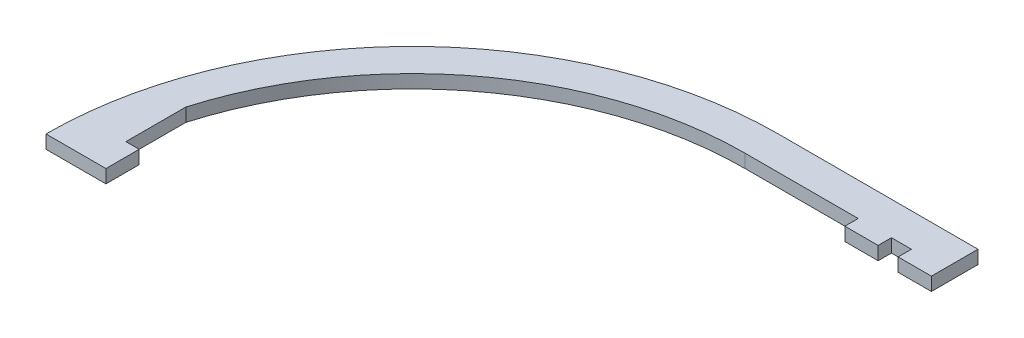
ISO-10303-21;
HEADER;
FILE_DESCRIPTION(('STEP AP214'),'2;1');
FILE_NAME('part.step','',(''),(''),'','','');
FILE_SCHEMA(('AUTOMOTIVE_DESIGN { 1 0 10303 214 1 1 1 1 }'));
ENDSEC;
DATA;
#1=APPLICATION_CONTEXT('core data for automotive mechanical design processes');
#2=APPLICATION_PROTOCOL_DEFINITION('international standard','automotive_design',2000,#1);
#3=PRODUCT_CONTEXT('',#1,'mechanical');
#4=PRODUCT('Part','Part','',(#3));
#5=PRODUCT_RELATED_PRODUCT_CATEGORY('part','',(#4));
#6=PRODUCT_DEFINITION_FORMATION('','',#4);
#7=PRODUCT_DEFINITION_CONTEXT('part definition',#1,'design');
#8=PRODUCT_DEFINITION('design','',#6,#7);
#9=PRODUCT_DEFINITION_SHAPE('','',#8);
#10=(LENGTH_UNIT() NAMED_UNIT(*) SI_UNIT(.MILLI.,.METRE.));
#11=(NAMED_UNIT(*) PLANE_ANGLE_UNIT() SI_UNIT($,.RADIAN.));
#12=(NAMED_UNIT(*) SI_UNIT($,.STERADIAN.) SOLID_ANGLE_UNIT());
#13=UNCERTAINTY_MEASURE_WITH_UNIT(LENGTH_MEASURE(1.E-05),#10,'distance_accuracy_value','');
#14=(GEOMETRIC_REPRESENTATION_CONTEXT(3) GLOBAL_UNCERTAINTY_ASSIGNED_CONTEXT((#13)) GLOBAL_UNIT_ASSIGNED_CONTEXT((#10,
#11,#12)) REPRESENTATION_CONTEXT('',''));
#15=CARTESIAN_POINT('',(0.,0.,0.));
#16=DIRECTION('',(0.,0.,1.));
#17=DIRECTION('',(1.,0.,0.));
#18=AXIS2_PLACEMENT_3D('',#15,#16,#17);
#19=CARTESIAN_POINT('',(0.,2.,-50.));
#20=DIRECTION('',(0.,0.,-1.));
#21=DIRECTION('',(-1.,0.,0.));
#22=AXIS2_PLACEMENT_3D('',#19,#20,#21);
#23=PLANE('',#22);
#24=DIRECTION('',(1.,0.,0.));
#25=VECTOR('',#24,1.);
#26=CARTESIAN_POINT('',(0.,2.,-50.));
#27=LINE('',#26,#25);
#28=CARTESIAN_POINT('',(22.,2.,-50.));
#29=VERTEX_POINT('',#28);
#30=CARTESIAN_POINT('',(25.,2.,-50.));
#31=VERTEX_POINT('',#30);
#32=EDGE_CURVE('E220',#29,#31,#27,.T.);
#33=ORIENTED_EDGE('',*,*,#32,.F.);
#34=DIRECTION('',(0.,-1.,0.));
#35=VECTOR('',#34,1.);
#36=CARTESIAN_POINT('',(22.,2.,-50.));
#37=LINE('',#36,#35);
#38=CARTESIAN_POINT('',(22.,0.,-50.));
#39=VERTEX_POINT('',#38);
#40=EDGE_CURVE('E11',#29,#39,#37,.T.);
#41=ORIENTED_EDGE('',*,*,#40,.T.);
#42=DIRECTION('',(1.,0.,0.));
#43=VECTOR('',#42,1.);
#44=CARTESIAN_POINT('',(0.,0.,-50.));
#45=LINE('',#44,#43);
#46=CARTESIAN_POINT('',(25.,0.,-50.));
#47=VERTEX_POINT('',#46);
#48=EDGE_CURVE('E233',#39,#47,#45,.T.);
#49=ORIENTED_EDGE('',*,*,#48,.T.);
#50=DIRECTION('',(0.,1.,0.));
#51=VECTOR('',#50,1.);
#52=CARTESIAN_POINT('',(25.,2.,-50.));
#53=LINE('',#52,#51);
#54=EDGE_CURVE('E253',#47,#31,#53,.T.);
#55=ORIENTED_EDGE('',*,*,#54,.T.);
#56=EDGE_LOOP('',(#33,#41,#49,#55));
#57=FACE_BOUND('',#56,.T.);
#58=ADVANCED_FACE('F36',(#57),#23,.F.);
#59=CARTESIAN_POINT('',(-65.5095490917518,-0.01,0.));
#60=DIRECTION('',(0.,0.,-1.));
#61=DIRECTION('',(-1.,0.,0.));
#62=AXIS2_PLACEMENT_3D('',#59,#60,#61);
#63=PLANE('',#62);
#64=DIRECTION('',(-1.,0.,0.));
#65=VECTOR('',#64,1.);
#66=CARTESIAN_POINT('',(0.,0.,0.));
#67=LINE('',#66,#65);
#68=CARTESIAN_POINT('',(-46.,0.,0.));
#69=VERTEX_POINT('',#68);
#70=CARTESIAN_POINT('',(-55.,0.,0.));
#71=VERTEX_POINT('',#70);
#72=EDGE_CURVE('E247',#69,#71,#67,.T.);
#73=ORIENTED_EDGE('',*,*,#72,.F.);
#74=DIRECTION('',(0.,1.,0.));
#75=VECTOR('',#74,1.);
#76=CARTESIAN_POINT('',(-46.,0.,0.));
#77=LINE('',#76,#75);
#78=CARTESIAN_POINT('',(-46.,2.,0.));
#79=VERTEX_POINT('',#78);
#80=EDGE_CURVE('E168',#69,#79,#77,.T.);
#81=ORIENTED_EDGE('',*,*,#80,.T.);
#82=DIRECTION('',(-1.,0.,0.));
#83=VECTOR('',#82,1.);
#84=CARTESIAN_POINT('',(0.,2.,0.));
#85=LINE('',#84,#83);
#86=CARTESIAN_POINT('',(-55.,2.,0.));
#87=VERTEX_POINT('',#86);
#88=EDGE_CURVE('E250',#79,#87,#85,.T.);
#89=ORIENTED_EDGE('',*,*,#88,.T.);
#90=DIRECTION('',(0.,-1.,0.));
#91=VECTOR('',#90,1.);
#92=CARTESIAN_POINT('',(-55.,2.,0.));
#93=LINE('',#92,#91);
#94=EDGE_CURVE('E249',#71,#87,#93,.F.);
#95=ORIENTED_EDGE('',*,*,#94,.F.);
#96=EDGE_LOOP('',(#73,#81,#89,#95));
#97=FACE_BOUND('',#96,.T.);
#98=ADVANCED_FACE('F38',(#97),#63,.F.);
#99=CARTESIAN_POINT('',(30.,2.,0.));
#100=DIRECTION('',(-1.,0.,0.));
#101=DIRECTION('',(0.,0.,1.));
#102=AXIS2_PLACEMENT_3D('',#99,#100,#101);
#103=PLANE('',#102);
#104=DIRECTION('',(0.,-1.,0.));
#105=VECTOR('',#104,1.);
#106=CARTESIAN_POINT('',(30.,2.,-55.));
#107=LINE('',#106,#105);
#108=CARTESIAN_POINT('',(30.,2.,-55.));
#109=VERTEX_POINT('',#108);
#110=CARTESIAN_POINT('',(30.,0.,-55.));
#111=VERTEX_POINT('',#110);
#112=EDGE_CURVE('E244',#109,#111,#107,.T.);
#113=ORIENTED_EDGE('',*,*,#112,.F.);
#114=DIRECTION('',(0.,0.,-1.));
#115=VECTOR('',#114,1.);
#116=CARTESIAN_POINT('',(30.,2.,0.));
#117=LINE('',#116,#115);
#118=CARTESIAN_POINT('',(30.,2.,-48.));
#119=VERTEX_POINT('',#118);
#120=EDGE_CURVE('E225',#119,#109,#117,.T.);
#121=ORIENTED_EDGE('',*,*,#120,.F.);
#122=DIRECTION('',(0.,1.,0.));
#123=VECTOR('',#122,1.);
#124=CARTESIAN_POINT('',(30.,0.,-48.));
#125=LINE('',#124,#123);
#126=CARTESIAN_POINT('',(30.,0.,-48.));
#127=VERTEX_POINT('',#126);
#128=EDGE_CURVE('E211',#127,#119,#125,.T.);
#129=ORIENTED_EDGE('',*,*,#128,.F.);
#130=DIRECTION('',(0.,0.,-1.));
#131=VECTOR('',#130,1.);
#132=CARTESIAN_POINT('',(30.,0.,0.));
#133=LINE('',#132,#131);
#134=EDGE_CURVE('E237',#127,#111,#133,.T.);
#135=ORIENTED_EDGE('',*,*,#134,.T.);
#136=EDGE_LOOP('',(#113,#121,#129,#135));
#137=FACE_BOUND('',#136,.T.);
#138=ADVANCED_FACE('F283',(#137),#103,.F.);
#139=CARTESIAN_POINT('',(0.,2.,-55.));
#140=DIRECTION('',(0.,0.,1.));
#141=DIRECTION('',(1.,0.,0.));
#142=AXIS2_PLACEMENT_3D('',#139,#140,#141);
#143=PLANE('',#142);
#144=DIRECTION('',(-1.,0.,0.));
#145=VECTOR('',#144,1.);
#146=CARTESIAN_POINT('',(0.,0.,-55.));
#147=LINE('',#146,#145);
#148=CARTESIAN_POINT('',(0.,0.,-55.));
#149=VERTEX_POINT('',#148);
#150=EDGE_CURVE('E239',#111,#149,#147,.T.);
#151=ORIENTED_EDGE('',*,*,#150,.T.);
#152=DIRECTION('',(0.,-1.,0.));
#153=VECTOR('',#152,1.);
#154=CARTESIAN_POINT('',(0.,2.,-55.));
#155=LINE('',#154,#153);
#156=CARTESIAN_POINT('',(0.,2.,-55.));
#157=VERTEX_POINT('',#156);
#158=EDGE_CURVE('E230',#157,#149,#155,.T.);
#159=ORIENTED_EDGE('',*,*,#158,.F.);
#160=DIRECTION('',(-1.,0.,0.));
#161=VECTOR('',#160,1.);
#162=CARTESIAN_POINT('',(0.,2.,-55.));
#163=LINE('',#162,#161);
#164=EDGE_CURVE('E227',#109,#157,#163,.T.);
#165=ORIENTED_EDGE('',*,*,#164,.F.);
#166=ORIENTED_EDGE('',*,*,#112,.T.);
#167=EDGE_LOOP('',(#151,#159,#165,#166));
#168=FACE_BOUND('',#167,.T.);
#169=ADVANCED_FACE('F307',(#168),#143,.F.);
#170=CARTESIAN_POINT('',(0.,2.,0.));
#171=DIRECTION('',(0.,-1.,0.));
#172=DIRECTION('',(0.,0.,-1.));
#173=AXIS2_PLACEMENT_3D('',#170,#171,#172);
#174=CYLINDRICAL_SURFACE('',#173,55.);
#175=CARTESIAN_POINT('',(0.,0.,0.));
#176=DIRECTION('',(0.,1.,0.));
#177=DIRECTION('',(0.,0.,1.));
#178=AXIS2_PLACEMENT_3D('',#175,#176,#177);
#179=CIRCLE('',#178,55.);
#180=EDGE_CURVE('E214',#149,#71,#179,.T.);
#181=ORIENTED_EDGE('',*,*,#180,.T.);
#182=ORIENTED_EDGE('',*,*,#94,.T.);
#183=CARTESIAN_POINT('',(0.,2.,0.));
#184=DIRECTION('',(0.,1.,0.));
#185=DIRECTION('',(0.,0.,1.));
#186=AXIS2_PLACEMENT_3D('',#183,#184,#185);
#187=CIRCLE('',#186,55.);
#188=EDGE_CURVE('E217',#157,#87,#187,.T.);
#189=ORIENTED_EDGE('',*,*,#188,.F.);
#190=ORIENTED_EDGE('',*,*,#158,.T.);
#191=EDGE_LOOP('',(#181,#182,#189,#190));
#192=FACE_BOUND('',#191,.T.);
#193=ADVANCED_FACE('F306',(#192),#174,.T.);
#194=CARTESIAN_POINT('',(0.,2.,0.));
#195=DIRECTION('',(0.,-1.,0.));
#196=DIRECTION('',(0.,0.,-1.));
#197=AXIS2_PLACEMENT_3D('',#194,#195,#196);
#198=CYLINDRICAL_SURFACE('',#197,50.);
#199=DIRECTION('',(0.,1.,0.));
#200=VECTOR('',#199,1.);
#201=CARTESIAN_POINT('',(-48.,0.,-14.));
#202=LINE('',#201,#200);
#203=CARTESIAN_POINT('',(-48.,0.,-14.));
#204=VERTEX_POINT('',#203);
#205=CARTESIAN_POINT('',(-48.,2.,-14.));
#206=VERTEX_POINT('',#205);
#207=EDGE_CURVE('E51',#204,#206,#202,.T.);
#208=ORIENTED_EDGE('',*,*,#207,.F.);
#209=CARTESIAN_POINT('',(0.,0.,0.));
#210=DIRECTION('',(0.,1.,0.));
#211=DIRECTION('',(0.,0.,1.));
#212=AXIS2_PLACEMENT_3D('',#209,#210,#211);
#213=CIRCLE('',#212,50.);
#214=CARTESIAN_POINT('',(0.,0.,-50.));
#215=VERTEX_POINT('',#214);
#216=EDGE_CURVE('E221',#215,#204,#213,.T.);
#217=ORIENTED_EDGE('',*,*,#216,.F.);
#218=DIRECTION('',(0.,-1.,0.));
#219=VECTOR('',#218,1.);
#220=CARTESIAN_POINT('',(0.,2.,-50.));
#221=LINE('',#220,#219);
#222=CARTESIAN_POINT('',(0.,2.,-50.));
#223=VERTEX_POINT('',#222);
#224=EDGE_CURVE('E254',#223,#215,#221,.T.);
#225=ORIENTED_EDGE('',*,*,#224,.F.);
#226=CARTESIAN_POINT('',(0.,2.,0.));
#227=DIRECTION('',(0.,1.,0.));
#228=DIRECTION('',(0.,0.,1.));
#229=AXIS2_PLACEMENT_3D('',#226,#227,#228);
#230=CIRCLE('',#229,50.);
#231=EDGE_CURVE('E56',#223,#206,#230,.T.);
#232=ORIENTED_EDGE('',*,*,#231,.T.);
#233=EDGE_LOOP('',(#208,#217,#225,#232));
#234=FACE_BOUND('',#233,.T.);
#235=ADVANCED_FACE('F300',(#234),#198,.F.);
#236=CARTESIAN_POINT('',(0.,0.,0.));
#237=DIRECTION('',(0.,1.,0.));
#238=DIRECTION('',(0.,0.,1.));
#239=AXIS2_PLACEMENT_3D('',#236,#237,#238);
#240=PLANE('',#239);
#241=DIRECTION('',(0.,0.,1.));
#242=VECTOR('',#241,1.);
#243=CARTESIAN_POINT('',(17.,0.,-48.));
#244=LINE('',#243,#242);
#245=CARTESIAN_POINT('',(17.,0.,-50.));
#246=VERTEX_POINT('',#245);
#247=CARTESIAN_POINT('',(17.,0.,-48.));
#248=VERTEX_POINT('',#247);
#249=EDGE_CURVE('E184',#246,#248,#244,.T.);
#250=ORIENTED_EDGE('',*,*,#249,.F.);
#251=EDGE_CURVE('E234',#215,#246,#45,.T.);
#252=ORIENTED_EDGE('',*,*,#251,.F.);
#253=ORIENTED_EDGE('',*,*,#216,.T.);
#254=DIRECTION('',(0.,0.,-1.));
#255=VECTOR('',#254,1.);
#256=CARTESIAN_POINT('',(-48.,0.,0.));
#257=LINE('',#256,#255);
#258=CARTESIAN_POINT('',(-48.,0.,-5.));
#259=VERTEX_POINT('',#258);
#260=EDGE_CURVE('E154',#259,#204,#257,.T.);
#261=ORIENTED_EDGE('',*,*,#260,.F.);
#262=DIRECTION('',(-1.,0.,0.));
#263=VECTOR('',#262,1.);
#264=CARTESIAN_POINT('',(0.,0.,-5.));
#265=LINE('',#264,#263);
#266=CARTESIAN_POINT('',(-46.,0.,-5.));
#267=VERTEX_POINT('',#266);
#268=EDGE_CURVE('E146',#267,#259,#265,.T.);
#269=ORIENTED_EDGE('',*,*,#268,.F.);
#270=DIRECTION('',(0.,0.,-1.));
#271=VECTOR('',#270,1.);
#272=CARTESIAN_POINT('',(-46.,0.,0.));
#273=LINE('',#272,#271);
#274=EDGE_CURVE('E162',#69,#267,#273,.T.);
#275=ORIENTED_EDGE('',*,*,#274,.F.);
#276=ORIENTED_EDGE('',*,*,#72,.T.);
#277=ORIENTED_EDGE('',*,*,#180,.F.);
#278=ORIENTED_EDGE('',*,*,#150,.F.);
#279=ORIENTED_EDGE('',*,*,#134,.F.);
#280=DIRECTION('',(1.,0.,0.));
#281=VECTOR('',#280,1.);
#282=CARTESIAN_POINT('',(30.,0.,-48.));
#283=LINE('',#282,#281);
#284=CARTESIAN_POINT('',(25.,0.,-48.));
#285=VERTEX_POINT('',#284);
#286=EDGE_CURVE('E203',#285,#127,#283,.T.);
#287=ORIENTED_EDGE('',*,*,#286,.F.);
#288=DIRECTION('',(0.,0.,1.));
#289=VECTOR('',#288,1.);
#290=CARTESIAN_POINT('',(25.,0.,-48.));
#291=LINE('',#290,#289);
#292=EDGE_CURVE('E201',#47,#285,#291,.T.);
#293=ORIENTED_EDGE('',*,*,#292,.F.);
#294=ORIENTED_EDGE('',*,*,#48,.F.);
#295=DIRECTION('',(0.,0.,-1.));
#296=VECTOR('',#295,1.);
#297=CARTESIAN_POINT('',(22.,0.,-52.));
#298=LINE('',#297,#296);
#299=CARTESIAN_POINT('',(22.,0.,-48.));
#300=VERTEX_POINT('',#299);
#301=EDGE_CURVE('E182',#300,#39,#298,.T.);
#302=ORIENTED_EDGE('',*,*,#301,.F.);
#303=DIRECTION('',(1.,0.,0.));
#304=VECTOR('',#303,1.);
#305=CARTESIAN_POINT('',(22.,0.,-48.));
#306=LINE('',#305,#304);
#307=EDGE_CURVE('E187',#248,#300,#306,.T.);
#308=ORIENTED_EDGE('',*,*,#307,.F.);
#309=EDGE_LOOP('',(#250,#252,#253,#261,#269,#275,#276,#277,#278,#279,#287,#293,#294,#302,#308));
#310=FACE_BOUND('',#309,.T.);
#311=ADVANCED_FACE('F160',(#310),#240,.F.);
#312=CARTESIAN_POINT('',(0.,2.,0.));
#313=DIRECTION('',(0.,1.,0.));
#314=DIRECTION('',(0.,0.,1.));
#315=AXIS2_PLACEMENT_3D('',#312,#313,#314);
#316=PLANE('',#315);
#317=CARTESIAN_POINT('',(17.,2.,-50.));
#318=VERTEX_POINT('',#317);
#319=EDGE_CURVE('E222',#223,#318,#27,.T.);
#320=ORIENTED_EDGE('',*,*,#319,.T.);
#321=DIRECTION('',(0.,0.,1.));
#322=VECTOR('',#321,1.);
#323=CARTESIAN_POINT('',(17.,2.,-48.));
#324=LINE('',#323,#322);
#325=CARTESIAN_POINT('',(17.,2.,-48.));
#326=VERTEX_POINT('',#325);
#327=EDGE_CURVE('E179',#318,#326,#324,.T.);
#328=ORIENTED_EDGE('',*,*,#327,.T.);
#329=DIRECTION('',(1.,0.,0.));
#330=VECTOR('',#329,1.);
#331=CARTESIAN_POINT('',(22.,2.,-48.));
#332=LINE('',#331,#330);
#333=CARTESIAN_POINT('',(22.,2.,-48.));
#334=VERTEX_POINT('',#333);
#335=EDGE_CURVE('E192',#326,#334,#332,.T.);
#336=ORIENTED_EDGE('',*,*,#335,.T.);
#337=DIRECTION('',(0.,0.,-1.));
#338=VECTOR('',#337,1.);
#339=CARTESIAN_POINT('',(22.,2.,-50.));
#340=LINE('',#339,#338);
#341=EDGE_CURVE('E185',#334,#29,#340,.T.);
#342=ORIENTED_EDGE('',*,*,#341,.T.);
#343=ORIENTED_EDGE('',*,*,#32,.T.);
#344=DIRECTION('',(0.,0.,1.));
#345=VECTOR('',#344,1.);
#346=CARTESIAN_POINT('',(25.,2.,-48.));
#347=LINE('',#346,#345);
#348=CARTESIAN_POINT('',(25.,2.,-48.));
#349=VERTEX_POINT('',#348);
#350=EDGE_CURVE('E198',#31,#349,#347,.T.);
#351=ORIENTED_EDGE('',*,*,#350,.T.);
#352=DIRECTION('',(1.,0.,0.));
#353=VECTOR('',#352,1.);
#354=CARTESIAN_POINT('',(30.,2.,-48.));
#355=LINE('',#354,#353);
#356=EDGE_CURVE('E204',#349,#119,#355,.T.);
#357=ORIENTED_EDGE('',*,*,#356,.T.);
#358=ORIENTED_EDGE('',*,*,#120,.T.);
#359=ORIENTED_EDGE('',*,*,#164,.T.);
#360=ORIENTED_EDGE('',*,*,#188,.T.);
#361=ORIENTED_EDGE('',*,*,#88,.F.);
#362=DIRECTION('',(0.,0.,-1.));
#363=VECTOR('',#362,1.);
#364=CARTESIAN_POINT('',(-46.,2.,0.));
#365=LINE('',#364,#363);
#366=CARTESIAN_POINT('',(-46.,2.,-5.));
#367=VERTEX_POINT('',#366);
#368=EDGE_CURVE('E175',#79,#367,#365,.T.);
#369=ORIENTED_EDGE('',*,*,#368,.T.);
#370=DIRECTION('',(-1.,0.,0.));
#371=VECTOR('',#370,1.);
#372=CARTESIAN_POINT('',(0.,2.,-5.));
#373=LINE('',#372,#371);
#374=CARTESIAN_POINT('',(-48.,2.,-5.));
#375=VERTEX_POINT('',#374);
#376=EDGE_CURVE('E148',#367,#375,#373,.T.);
#377=ORIENTED_EDGE('',*,*,#376,.T.);
#378=DIRECTION('',(0.,0.,-1.));
#379=VECTOR('',#378,1.);
#380=CARTESIAN_POINT('',(-48.,2.,0.));
#381=LINE('',#380,#379);
#382=EDGE_CURVE('E169',#375,#206,#381,.T.);
#383=ORIENTED_EDGE('',*,*,#382,.T.);
#384=ORIENTED_EDGE('',*,*,#231,.F.);
#385=EDGE_LOOP('',(#320,#328,#336,#342,#343,#351,#357,#358,#359,#360,#361,#369,#377,#383,#384));
#386=FACE_BOUND('',#385,.T.);
#387=ADVANCED_FACE('F264',(#386),#316,.T.);
#388=ORIENTED_EDGE('',*,*,#251,.T.);
#389=DIRECTION('',(0.,1.,0.));
#390=VECTOR('',#389,1.);
#391=CARTESIAN_POINT('',(17.,2.,-50.));
#392=LINE('',#391,#390);
#393=EDGE_CURVE('E44',#246,#318,#392,.T.);
#394=ORIENTED_EDGE('',*,*,#393,.T.);
#395=ORIENTED_EDGE('',*,*,#319,.F.);
#396=ORIENTED_EDGE('',*,*,#224,.T.);
#397=EDGE_LOOP('',(#388,#394,#395,#396));
#398=FACE_BOUND('',#397,.T.);
#399=ADVANCED_FACE('F261',(#398),#23,.F.);
#400=CARTESIAN_POINT('',(25.,0.,-48.));
#401=DIRECTION('',(-1.,0.,0.));
#402=DIRECTION('',(0.,0.,1.));
#403=AXIS2_PLACEMENT_3D('',#400,#401,#402);
#404=PLANE('',#403);
#405=ORIENTED_EDGE('',*,*,#54,.F.);
#406=ORIENTED_EDGE('',*,*,#292,.T.);
#407=DIRECTION('',(0.,1.,0.));
#408=VECTOR('',#407,1.);
#409=CARTESIAN_POINT('',(25.,0.,-48.));
#410=LINE('',#409,#408);
#411=EDGE_CURVE('E207',#285,#349,#410,.T.);
#412=ORIENTED_EDGE('',*,*,#411,.T.);
#413=ORIENTED_EDGE('',*,*,#350,.F.);
#414=EDGE_LOOP('',(#405,#406,#412,#413));
#415=FACE_BOUND('',#414,.T.);
#416=ADVANCED_FACE('F288',(#415),#404,.T.);
#417=CARTESIAN_POINT('',(30.,0.,-48.));
#418=DIRECTION('',(0.,0.,1.));
#419=DIRECTION('',(1.,0.,0.));
#420=AXIS2_PLACEMENT_3D('',#417,#418,#419);
#421=PLANE('',#420);
#422=ORIENTED_EDGE('',*,*,#356,.F.);
#423=ORIENTED_EDGE('',*,*,#411,.F.);
#424=ORIENTED_EDGE('',*,*,#286,.T.);
#425=ORIENTED_EDGE('',*,*,#128,.T.);
#426=EDGE_LOOP('',(#422,#423,#424,#425));
#427=FACE_BOUND('',#426,.T.);
#428=ADVANCED_FACE('F293',(#427),#421,.T.);
#429=CARTESIAN_POINT('',(22.,0.,-50.));
#430=DIRECTION('',(1.,0.,0.));
#431=DIRECTION('',(0.,0.,-1.));
#432=AXIS2_PLACEMENT_3D('',#429,#430,#431);
#433=PLANE('',#432);
#434=ORIENTED_EDGE('',*,*,#40,.F.);
#435=ORIENTED_EDGE('',*,*,#341,.F.);
#436=DIRECTION('',(0.,1.,0.));
#437=VECTOR('',#436,1.);
#438=CARTESIAN_POINT('',(22.,0.,-48.));
#439=LINE('',#438,#437);
#440=EDGE_CURVE('E196',#300,#334,#439,.T.);
#441=ORIENTED_EDGE('',*,*,#440,.F.);
#442=ORIENTED_EDGE('',*,*,#301,.T.);
#443=EDGE_LOOP('',(#434,#435,#441,#442));
#444=FACE_BOUND('',#443,.T.);
#445=ADVANCED_FACE('F382',(#444),#433,.T.);
#446=CARTESIAN_POINT('',(17.,0.,-48.));
#447=DIRECTION('',(-1.,0.,0.));
#448=DIRECTION('',(0.,0.,1.));
#449=AXIS2_PLACEMENT_3D('',#446,#447,#448);
#450=PLANE('',#449);
#451=ORIENTED_EDGE('',*,*,#393,.F.);
#452=ORIENTED_EDGE('',*,*,#249,.T.);
#453=DIRECTION('',(0.,1.,0.));
#454=VECTOR('',#453,1.);
#455=CARTESIAN_POINT('',(17.,0.,-48.));
#456=LINE('',#455,#454);
#457=EDGE_CURVE('E190',#248,#326,#456,.T.);
#458=ORIENTED_EDGE('',*,*,#457,.T.);
#459=ORIENTED_EDGE('',*,*,#327,.F.);
#460=EDGE_LOOP('',(#451,#452,#458,#459));
#461=FACE_BOUND('',#460,.T.);
#462=ADVANCED_FACE('F374',(#461),#450,.T.);
#463=CARTESIAN_POINT('',(22.,0.,-48.));
#464=DIRECTION('',(0.,0.,1.));
#465=DIRECTION('',(1.,0.,0.));
#466=AXIS2_PLACEMENT_3D('',#463,#464,#465);
#467=PLANE('',#466);
#468=ORIENTED_EDGE('',*,*,#335,.F.);
#469=ORIENTED_EDGE('',*,*,#457,.F.);
#470=ORIENTED_EDGE('',*,*,#307,.T.);
#471=ORIENTED_EDGE('',*,*,#440,.T.);
#472=EDGE_LOOP('',(#468,#469,#470,#471));
#473=FACE_BOUND('',#472,.T.);
#474=ADVANCED_FACE('F275',(#473),#467,.T.);
#475=CARTESIAN_POINT('',(-46.,0.,0.));
#476=DIRECTION('',(1.,0.,0.));
#477=DIRECTION('',(0.,0.,-1.));
#478=AXIS2_PLACEMENT_3D('',#475,#476,#477);
#479=PLANE('',#478);
#480=ORIENTED_EDGE('',*,*,#368,.F.);
#481=ORIENTED_EDGE('',*,*,#80,.F.);
#482=ORIENTED_EDGE('',*,*,#274,.T.);
#483=DIRECTION('',(0.,1.,0.));
#484=VECTOR('',#483,1.);
#485=CARTESIAN_POINT('',(-46.,0.,-5.));
#486=LINE('',#485,#484);
#487=EDGE_CURVE('E143',#267,#367,#486,.T.);
#488=ORIENTED_EDGE('',*,*,#487,.T.);
#489=EDGE_LOOP('',(#480,#481,#482,#488));
#490=FACE_BOUND('',#489,.T.);
#491=ADVANCED_FACE('F166',(#490),#479,.T.);
#492=CARTESIAN_POINT('',(-48.,0.,0.));
#493=DIRECTION('',(1.,0.,0.));
#494=DIRECTION('',(0.,0.,-1.));
#495=AXIS2_PLACEMENT_3D('',#492,#493,#494);
#496=PLANE('',#495);
#497=ORIENTED_EDGE('',*,*,#382,.F.);
#498=DIRECTION('',(0.,1.,0.));
#499=VECTOR('',#498,1.);
#500=CARTESIAN_POINT('',(-48.,0.,-5.));
#501=LINE('',#500,#499);
#502=EDGE_CURVE('E153',#259,#375,#501,.T.);
#503=ORIENTED_EDGE('',*,*,#502,.F.);
#504=ORIENTED_EDGE('',*,*,#260,.T.);
#505=ORIENTED_EDGE('',*,*,#207,.T.);
#506=EDGE_LOOP('',(#497,#503,#504,#505));
#507=FACE_BOUND('',#506,.T.);
#508=ADVANCED_FACE('F267',(#507),#496,.T.);
#509=CARTESIAN_POINT('',(0.,0.,-5.));
#510=DIRECTION('',(0.,0.,-1.));
#511=DIRECTION('',(-1.,0.,0.));
#512=AXIS2_PLACEMENT_3D('',#509,#510,#511);
#513=PLANE('',#512);
#514=ORIENTED_EDGE('',*,*,#376,.F.);
#515=ORIENTED_EDGE('',*,*,#487,.F.);
#516=ORIENTED_EDGE('',*,*,#268,.T.);
#517=ORIENTED_EDGE('',*,*,#502,.T.);
#518=EDGE_LOOP('',(#514,#515,#516,#517));
#519=FACE_BOUND('',#518,.T.);
#520=ADVANCED_FACE('F145',(#519),#513,.T.);
#521=CLOSED_SHELL('',(#58,#98,#138,#169,#193,#235,#311,#387,#399,#416,#428,#445,#462,#474,#491,
#508,#520));
#522=MANIFOLD_SOLID_BREP('B2',#521);
#523=ADVANCED_BREP_SHAPE_REPRESENTATION('',(#18,#522),#14);
#524=SHAPE_DEFINITION_REPRESENTATION(#9,#523);
ENDSEC;
END-ISO-10303-21;
